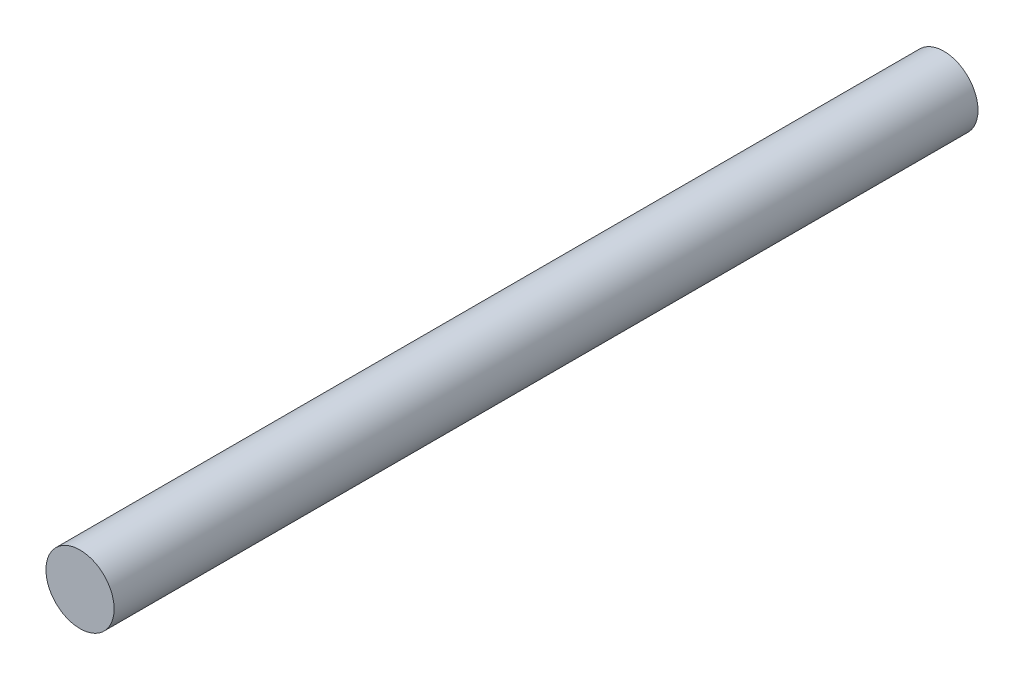
ISO-10303-21;
HEADER;
FILE_DESCRIPTION(('STEP AP214'),'2;1');
FILE_NAME('part.step','',(''),(''),'','','');
FILE_SCHEMA(('AUTOMOTIVE_DESIGN { 1 0 10303 214 1 1 1 1 }'));
ENDSEC;
DATA;
#1=APPLICATION_CONTEXT('core data for automotive mechanical design processes');
#2=APPLICATION_PROTOCOL_DEFINITION('international standard','automotive_design',2000,#1);
#3=PRODUCT_CONTEXT('',#1,'mechanical');
#4=PRODUCT('Part','Part','',(#3));
#5=PRODUCT_RELATED_PRODUCT_CATEGORY('part','',(#4));
#6=PRODUCT_DEFINITION_FORMATION('','',#4);
#7=PRODUCT_DEFINITION_CONTEXT('part definition',#1,'design');
#8=PRODUCT_DEFINITION('design','',#6,#7);
#9=PRODUCT_DEFINITION_SHAPE('','',#8);
#10=(LENGTH_UNIT() NAMED_UNIT(*) SI_UNIT(.MILLI.,.METRE.));
#11=(NAMED_UNIT(*) PLANE_ANGLE_UNIT() SI_UNIT($,.RADIAN.));
#12=(NAMED_UNIT(*) SI_UNIT($,.STERADIAN.) SOLID_ANGLE_UNIT());
#13=UNCERTAINTY_MEASURE_WITH_UNIT(LENGTH_MEASURE(1.E-05),#10,'distance_accuracy_value','');
#14=(GEOMETRIC_REPRESENTATION_CONTEXT(3) GLOBAL_UNCERTAINTY_ASSIGNED_CONTEXT((#13)) GLOBAL_UNIT_ASSIGNED_CONTEXT((#10,
#11,#12)) REPRESENTATION_CONTEXT('',''));
#15=CARTESIAN_POINT('',(0.,0.,0.));
#16=DIRECTION('',(0.,0.,1.));
#17=DIRECTION('',(1.,0.,0.));
#18=AXIS2_PLACEMENT_3D('',#15,#16,#17);
#19=CARTESIAN_POINT('',(0.,0.,19.));
#20=DIRECTION('',(0.,0.,-1.));
#21=DIRECTION('',(-1.,0.,0.));
#22=AXIS2_PLACEMENT_3D('',#19,#20,#21);
#23=CYLINDRICAL_SURFACE('',#22,0.75);
#24=CARTESIAN_POINT('',(0.,0.,19.));
#25=DIRECTION('',(0.,0.,1.));
#26=DIRECTION('',(1.,0.,0.));
#27=AXIS2_PLACEMENT_3D('',#24,#25,#26);
#28=CIRCLE('',#27,0.75);
#29=CARTESIAN_POINT('',(0.75,0.,19.));
#30=VERTEX_POINT('',#29);
#31=EDGE_CURVE('E10',#30,#30,#28,.T.);
#32=ORIENTED_EDGE('',*,*,#31,.F.);
#33=EDGE_LOOP('',(#32));
#34=FACE_BOUND('',#33,.T.);
#35=CARTESIAN_POINT('',(0.,0.,0.));
#36=DIRECTION('',(0.,0.,1.));
#37=DIRECTION('',(1.,0.,0.));
#38=AXIS2_PLACEMENT_3D('',#35,#36,#37);
#39=CIRCLE('',#38,0.75);
#40=CARTESIAN_POINT('',(0.75,0.,0.));
#41=VERTEX_POINT('',#40);
#42=EDGE_CURVE('E40',#41,#41,#39,.T.);
#43=ORIENTED_EDGE('',*,*,#42,.T.);
#44=EDGE_LOOP('',(#43));
#45=FACE_BOUND('',#44,.T.);
#46=ADVANCED_FACE('F37',(#34,#45),#23,.T.);
#47=CARTESIAN_POINT('',(0.,0.,19.));
#48=DIRECTION('',(0.,0.,1.));
#49=DIRECTION('',(1.,0.,0.));
#50=AXIS2_PLACEMENT_3D('',#47,#48,#49);
#51=PLANE('',#50);
#52=ORIENTED_EDGE('',*,*,#31,.T.);
#53=EDGE_LOOP('',(#52));
#54=FACE_BOUND('',#53,.T.);
#55=ADVANCED_FACE('F52',(#54),#51,.T.);
#56=CARTESIAN_POINT('',(0.,0.,0.));
#57=DIRECTION('',(0.,0.,1.));
#58=DIRECTION('',(1.,0.,0.));
#59=AXIS2_PLACEMENT_3D('',#56,#57,#58);
#60=PLANE('',#59);
#61=ORIENTED_EDGE('',*,*,#42,.F.);
#62=EDGE_LOOP('',(#61));
#63=FACE_BOUND('',#62,.T.);
#64=ADVANCED_FACE('F50',(#63),#60,.F.);
#65=CLOSED_SHELL('',(#46,#55,#64));
#66=MANIFOLD_SOLID_BREP('B2',#65);
#67=ADVANCED_BREP_SHAPE_REPRESENTATION('',(#18,#66),#14);
#68=SHAPE_DEFINITION_REPRESENTATION(#9,#67);
ENDSEC;
END-ISO-10303-21;
